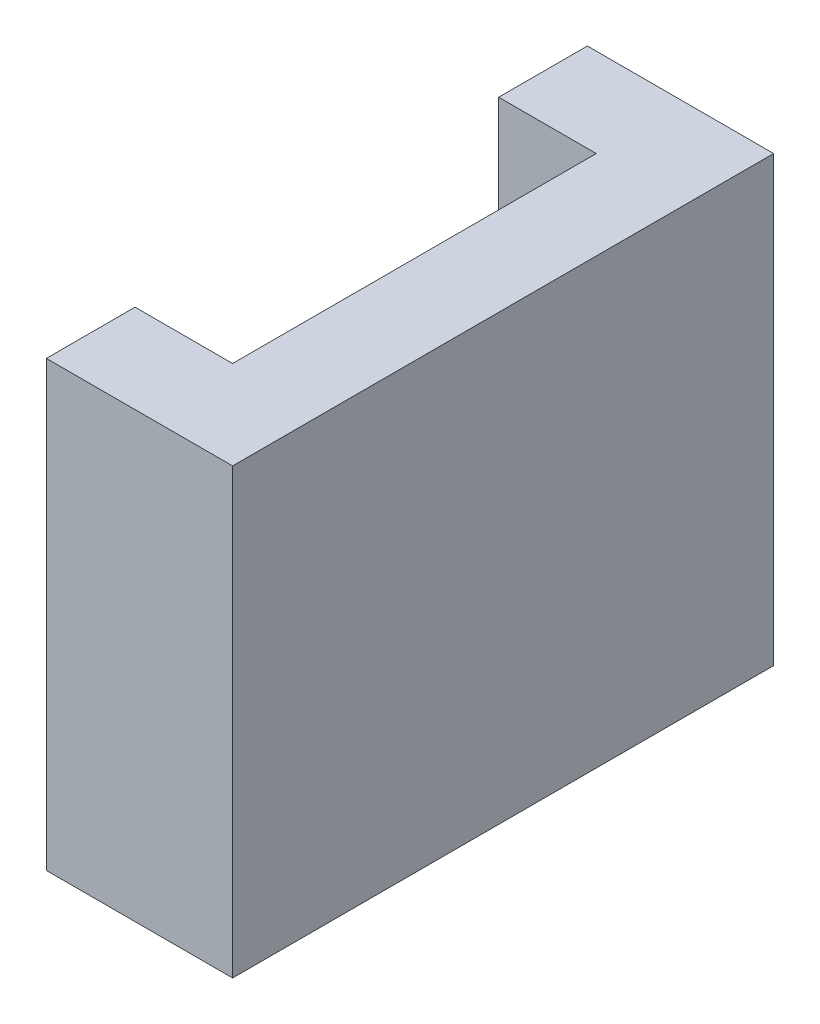
ISO-10303-21;
HEADER;
FILE_DESCRIPTION(('STEP AP214'),'2;1');
FILE_NAME('part.step','',(''),(''),'','','');
FILE_SCHEMA(('AUTOMOTIVE_DESIGN { 1 0 10303 214 1 1 1 1 }'));
ENDSEC;
DATA;
#1=APPLICATION_CONTEXT('core data for automotive mechanical design processes');
#2=APPLICATION_PROTOCOL_DEFINITION('international standard','automotive_design',2000,#1);
#3=PRODUCT_CONTEXT('',#1,'mechanical');
#4=PRODUCT('Part','Part','',(#3));
#5=PRODUCT_RELATED_PRODUCT_CATEGORY('part','',(#4));
#6=PRODUCT_DEFINITION_FORMATION('','',#4);
#7=PRODUCT_DEFINITION_CONTEXT('part definition',#1,'design');
#8=PRODUCT_DEFINITION('design','',#6,#7);
#9=PRODUCT_DEFINITION_SHAPE('','',#8);
#10=(LENGTH_UNIT() NAMED_UNIT(*) SI_UNIT(.MILLI.,.METRE.));
#11=(NAMED_UNIT(*) PLANE_ANGLE_UNIT() SI_UNIT($,.RADIAN.));
#12=(NAMED_UNIT(*) SI_UNIT($,.STERADIAN.) SOLID_ANGLE_UNIT());
#13=UNCERTAINTY_MEASURE_WITH_UNIT(LENGTH_MEASURE(1.E-05),#10,'distance_accuracy_value','');
#14=(GEOMETRIC_REPRESENTATION_CONTEXT(3) GLOBAL_UNCERTAINTY_ASSIGNED_CONTEXT((#13)) GLOBAL_UNIT_ASSIGNED_CONTEXT((#10,
#11,#12)) REPRESENTATION_CONTEXT('',''));
#15=CARTESIAN_POINT('',(0.,0.,0.));
#16=DIRECTION('',(0.,0.,1.));
#17=DIRECTION('',(1.,0.,0.));
#18=AXIS2_PLACEMENT_3D('',#15,#16,#17);
#19=CARTESIAN_POINT('',(5.5,0.,-10.6546391752577));
#20=DIRECTION('',(0.,0.,-1.));
#21=DIRECTION('',(0.,1.,0.));
#22=AXIS2_PLACEMENT_3D('',#19,#20,#21);
#23=PLANE('',#22);
#24=DIRECTION('',(0.,-1.,0.));
#25=VECTOR('',#24,1.);
#26=CARTESIAN_POINT('',(0.,0.,-10.6546391752577));
#27=LINE('',#26,#25);
#28=CARTESIAN_POINT('',(0.,13.1413205577831,-10.6546391752577));
#29=VERTEX_POINT('',#28);
#30=CARTESIAN_POINT('',(0.,-11.8586794422169,-10.6546391752577));
#31=VERTEX_POINT('',#30);
#32=EDGE_CURVE('E116',#29,#31,#27,.T.);
#33=ORIENTED_EDGE('',*,*,#32,.F.);
#34=DIRECTION('',(-1.,0.,0.));
#35=VECTOR('',#34,1.);
#36=CARTESIAN_POINT('',(5.5,13.1413205577831,-10.6546391752577));
#37=LINE('',#36,#35);
#38=CARTESIAN_POINT('',(10.5,13.1413205577831,-10.6546391752577));
#39=VERTEX_POINT('',#38);
#40=EDGE_CURVE('E11',#39,#29,#37,.T.);
#41=ORIENTED_EDGE('',*,*,#40,.F.);
#42=DIRECTION('',(0.,1.,0.));
#43=VECTOR('',#42,1.);
#44=CARTESIAN_POINT('',(10.5,13.1413205577831,-10.6546391752577));
#45=LINE('',#44,#43);
#46=CARTESIAN_POINT('',(10.5,-11.8586794422169,-10.6546391752577));
#47=VERTEX_POINT('',#46);
#48=EDGE_CURVE('E193',#47,#39,#45,.T.);
#49=ORIENTED_EDGE('',*,*,#48,.F.);
#50=DIRECTION('',(-1.,0.,0.));
#51=VECTOR('',#50,1.);
#52=CARTESIAN_POINT('',(5.5,-11.8586794422169,-10.6546391752577));
#53=LINE('',#52,#51);
#54=EDGE_CURVE('E111',#47,#31,#53,.T.);
#55=ORIENTED_EDGE('',*,*,#54,.T.);
#56=EDGE_LOOP('',(#33,#41,#49,#55));
#57=FACE_BOUND('',#56,.T.);
#58=ADVANCED_FACE('F41',(#57),#23,.T.);
#59=CARTESIAN_POINT('',(5.5,0.,-5.65463917525774));
#60=DIRECTION('',(0.,0.,-1.));
#61=DIRECTION('',(0.,1.,0.));
#62=AXIS2_PLACEMENT_3D('',#59,#60,#61);
#63=PLANE('',#62);
#64=DIRECTION('',(0.,-1.,0.));
#65=VECTOR('',#64,1.);
#66=CARTESIAN_POINT('',(0.,0.,-5.65463917525774));
#67=LINE('',#66,#65);
#68=CARTESIAN_POINT('',(0.,13.1413205577831,-5.65463917525773));
#69=VERTEX_POINT('',#68);
#70=CARTESIAN_POINT('',(0.,-6.85867944221686,-5.65463917525774));
#71=VERTEX_POINT('',#70);
#72=EDGE_CURVE('E145',#69,#71,#67,.T.);
#73=ORIENTED_EDGE('',*,*,#72,.T.);
#74=DIRECTION('',(-1.,0.,0.));
#75=VECTOR('',#74,1.);
#76=CARTESIAN_POINT('',(5.5,-6.85867944221686,-5.65463917525774));
#77=LINE('',#76,#75);
#78=CARTESIAN_POINT('',(5.5,-6.85867944221686,-5.65463917525774));
#79=VERTEX_POINT('',#78);
#80=EDGE_CURVE('E135',#79,#71,#77,.T.);
#81=ORIENTED_EDGE('',*,*,#80,.F.);
#82=DIRECTION('',(0.,-1.,0.));
#83=VECTOR('',#82,1.);
#84=CARTESIAN_POINT('',(5.5,0.,-5.65463917525774));
#85=LINE('',#84,#83);
#86=CARTESIAN_POINT('',(5.5,13.1413205577831,-5.65463917525773));
#87=VERTEX_POINT('',#86);
#88=EDGE_CURVE('E118',#87,#79,#85,.T.);
#89=ORIENTED_EDGE('',*,*,#88,.F.);
#90=DIRECTION('',(-1.,0.,0.));
#91=VECTOR('',#90,1.);
#92=CARTESIAN_POINT('',(5.5,13.1413205577831,-5.65463917525773));
#93=LINE('',#92,#91);
#94=EDGE_CURVE('E50',#87,#69,#93,.T.);
#95=ORIENTED_EDGE('',*,*,#94,.T.);
#96=EDGE_LOOP('',(#73,#81,#89,#95));
#97=FACE_BOUND('',#96,.T.);
#98=ADVANCED_FACE('F143',(#97),#63,.F.);
#99=CARTESIAN_POINT('',(5.5,-6.85867944221686,0.));
#100=DIRECTION('',(0.,1.,0.));
#101=DIRECTION('',(0.,0.,1.));
#102=AXIS2_PLACEMENT_3D('',#99,#100,#101);
#103=PLANE('',#102);
#104=DIRECTION('',(0.,0.,-1.));
#105=VECTOR('',#104,1.);
#106=CARTESIAN_POINT('',(0.,-6.85867944221686,0.));
#107=LINE('',#106,#105);
#108=CARTESIAN_POINT('',(0.,-6.85867944221686,14.8453608247423));
#109=VERTEX_POINT('',#108);
#110=EDGE_CURVE('E154',#109,#71,#107,.T.);
#111=ORIENTED_EDGE('',*,*,#110,.F.);
#112=DIRECTION('',(-1.,0.,0.));
#113=VECTOR('',#112,1.);
#114=CARTESIAN_POINT('',(5.5,-6.85867944221686,14.8453608247423));
#115=LINE('',#114,#113);
#116=CARTESIAN_POINT('',(5.5,-6.85867944221686,14.8453608247423));
#117=VERTEX_POINT('',#116);
#118=EDGE_CURVE('E132',#117,#109,#115,.T.);
#119=ORIENTED_EDGE('',*,*,#118,.F.);
#120=DIRECTION('',(0.,0.,-1.));
#121=VECTOR('',#120,1.);
#122=CARTESIAN_POINT('',(5.5,-6.85867944221686,0.));
#123=LINE('',#122,#121);
#124=EDGE_CURVE('E57',#117,#79,#123,.T.);
#125=ORIENTED_EDGE('',*,*,#124,.T.);
#126=ORIENTED_EDGE('',*,*,#80,.T.);
#127=EDGE_LOOP('',(#111,#119,#125,#126));
#128=FACE_BOUND('',#127,.T.);
#129=ADVANCED_FACE('F177',(#128),#103,.T.);
#130=CARTESIAN_POINT('',(5.5,0.,14.8453608247423));
#131=DIRECTION('',(0.,0.,-1.));
#132=DIRECTION('',(0.,1.,0.));
#133=AXIS2_PLACEMENT_3D('',#130,#131,#132);
#134=PLANE('',#133);
#135=DIRECTION('',(0.,-1.,0.));
#136=VECTOR('',#135,1.);
#137=CARTESIAN_POINT('',(0.,0.,14.8453608247423));
#138=LINE('',#137,#136);
#139=CARTESIAN_POINT('',(0.,13.1413205577831,14.8453608247423));
#140=VERTEX_POINT('',#139);
#141=EDGE_CURVE('E166',#140,#109,#138,.T.);
#142=ORIENTED_EDGE('',*,*,#141,.F.);
#143=DIRECTION('',(-1.,0.,0.));
#144=VECTOR('',#143,1.);
#145=CARTESIAN_POINT('',(5.5,13.1413205577831,14.8453608247423));
#146=LINE('',#145,#144);
#147=CARTESIAN_POINT('',(5.5,13.1413205577831,14.8453608247423));
#148=VERTEX_POINT('',#147);
#149=EDGE_CURVE('E129',#148,#140,#146,.T.);
#150=ORIENTED_EDGE('',*,*,#149,.F.);
#151=DIRECTION('',(0.,-1.,0.));
#152=VECTOR('',#151,1.);
#153=CARTESIAN_POINT('',(5.5,0.,14.8453608247423));
#154=LINE('',#153,#152);
#155=EDGE_CURVE('E125',#148,#117,#154,.T.);
#156=ORIENTED_EDGE('',*,*,#155,.T.);
#157=ORIENTED_EDGE('',*,*,#118,.T.);
#158=EDGE_LOOP('',(#142,#150,#156,#157));
#159=FACE_BOUND('',#158,.T.);
#160=ADVANCED_FACE('F173',(#159),#134,.T.);
#161=CARTESIAN_POINT('',(5.5,13.1413205577831,0.));
#162=DIRECTION('',(0.,1.,0.));
#163=DIRECTION('',(0.,0.,1.));
#164=AXIS2_PLACEMENT_3D('',#161,#162,#163);
#165=PLANE('',#164);
#166=DIRECTION('',(0.,0.,-1.));
#167=VECTOR('',#166,1.);
#168=CARTESIAN_POINT('',(0.,13.1413205577831,0.));
#169=LINE('',#168,#167);
#170=CARTESIAN_POINT('',(0.,13.1413205577831,19.8453608247423));
#171=VERTEX_POINT('',#170);
#172=EDGE_CURVE('E100',#171,#140,#169,.T.);
#173=ORIENTED_EDGE('',*,*,#172,.F.);
#174=DIRECTION('',(-1.,0.,0.));
#175=VECTOR('',#174,1.);
#176=CARTESIAN_POINT('',(5.5,13.1413205577831,19.8453608247423));
#177=LINE('',#176,#175);
#178=CARTESIAN_POINT('',(10.5,13.1413205577831,19.8453608247423));
#179=VERTEX_POINT('',#178);
#180=EDGE_CURVE('E93',#179,#171,#177,.T.);
#181=ORIENTED_EDGE('',*,*,#180,.F.);
#182=DIRECTION('',(0.,0.,1.));
#183=VECTOR('',#182,1.);
#184=CARTESIAN_POINT('',(10.5,13.1413205577831,19.8453608247423));
#185=LINE('',#184,#183);
#186=EDGE_CURVE('E163',#39,#179,#185,.T.);
#187=ORIENTED_EDGE('',*,*,#186,.F.);
#188=ORIENTED_EDGE('',*,*,#40,.T.);
#189=EDGE_CURVE('E151',#69,#29,#169,.T.);
#190=ORIENTED_EDGE('',*,*,#189,.F.);
#191=ORIENTED_EDGE('',*,*,#94,.F.);
#192=DIRECTION('',(0.,0.,1.));
#193=VECTOR('',#192,1.);
#194=CARTESIAN_POINT('',(5.5,13.1413205577831,19.8453608247423));
#195=LINE('',#194,#193);
#196=EDGE_CURVE('E203',#87,#148,#195,.T.);
#197=ORIENTED_EDGE('',*,*,#196,.T.);
#198=ORIENTED_EDGE('',*,*,#149,.T.);
#199=EDGE_LOOP('',(#173,#181,#187,#188,#190,#191,#197,#198));
#200=FACE_BOUND('',#199,.T.);
#201=ADVANCED_FACE('F157',(#200),#165,.T.);
#202=CARTESIAN_POINT('',(5.5,0.,19.8453608247423));
#203=DIRECTION('',(0.,0.,-1.));
#204=DIRECTION('',(-1.,0.,0.));
#205=AXIS2_PLACEMENT_3D('',#202,#203,#204);
#206=PLANE('',#205);
#207=DIRECTION('',(0.,-1.,0.));
#208=VECTOR('',#207,1.);
#209=CARTESIAN_POINT('',(0.,0.,19.8453608247423));
#210=LINE('',#209,#208);
#211=CARTESIAN_POINT('',(0.,-11.8586794422169,19.8453608247423));
#212=VERTEX_POINT('',#211);
#213=EDGE_CURVE('E85',#171,#212,#210,.T.);
#214=ORIENTED_EDGE('',*,*,#213,.T.);
#215=DIRECTION('',(-1.,0.,0.));
#216=VECTOR('',#215,1.);
#217=CARTESIAN_POINT('',(5.5,-11.8586794422169,19.8453608247423));
#218=LINE('',#217,#216);
#219=CARTESIAN_POINT('',(10.5,-11.8586794422169,19.8453608247423));
#220=VERTEX_POINT('',#219);
#221=EDGE_CURVE('E90',#220,#212,#218,.T.);
#222=ORIENTED_EDGE('',*,*,#221,.F.);
#223=DIRECTION('',(0.,-1.,0.));
#224=VECTOR('',#223,1.);
#225=CARTESIAN_POINT('',(10.5,13.1413205577831,19.8453608247423));
#226=LINE('',#225,#224);
#227=EDGE_CURVE('E194',#179,#220,#226,.T.);
#228=ORIENTED_EDGE('',*,*,#227,.F.);
#229=ORIENTED_EDGE('',*,*,#180,.T.);
#230=EDGE_LOOP('',(#214,#222,#228,#229));
#231=FACE_BOUND('',#230,.T.);
#232=ADVANCED_FACE('F87',(#231),#206,.F.);
#233=CARTESIAN_POINT('',(5.5,-11.8586794422169,0.));
#234=DIRECTION('',(0.,1.,0.));
#235=DIRECTION('',(0.,0.,1.));
#236=AXIS2_PLACEMENT_3D('',#233,#234,#235);
#237=PLANE('',#236);
#238=DIRECTION('',(0.,0.,-1.));
#239=VECTOR('',#238,1.);
#240=CARTESIAN_POINT('',(0.,-11.8586794422169,0.));
#241=LINE('',#240,#239);
#242=EDGE_CURVE('E99',#212,#31,#241,.T.);
#243=ORIENTED_EDGE('',*,*,#242,.T.);
#244=ORIENTED_EDGE('',*,*,#54,.F.);
#245=DIRECTION('',(0.,0.,-1.));
#246=VECTOR('',#245,1.);
#247=CARTESIAN_POINT('',(10.5,-11.8586794422169,19.8453608247423));
#248=LINE('',#247,#246);
#249=EDGE_CURVE('E108',#220,#47,#248,.T.);
#250=ORIENTED_EDGE('',*,*,#249,.F.);
#251=ORIENTED_EDGE('',*,*,#221,.T.);
#252=EDGE_LOOP('',(#243,#244,#250,#251));
#253=FACE_BOUND('',#252,.T.);
#254=ADVANCED_FACE('F104',(#253),#237,.F.);
#255=CARTESIAN_POINT('',(0.,0.,0.));
#256=DIRECTION('',(1.,0.,0.));
#257=DIRECTION('',(0.,0.,-1.));
#258=AXIS2_PLACEMENT_3D('',#255,#256,#257);
#259=PLANE('',#258);
#260=ORIENTED_EDGE('',*,*,#32,.T.);
#261=ORIENTED_EDGE('',*,*,#242,.F.);
#262=ORIENTED_EDGE('',*,*,#213,.F.);
#263=ORIENTED_EDGE('',*,*,#172,.T.);
#264=ORIENTED_EDGE('',*,*,#141,.T.);
#265=ORIENTED_EDGE('',*,*,#110,.T.);
#266=ORIENTED_EDGE('',*,*,#72,.F.);
#267=ORIENTED_EDGE('',*,*,#189,.T.);
#268=EDGE_LOOP('',(#260,#261,#262,#263,#264,#265,#266,#267));
#269=FACE_BOUND('',#268,.T.);
#270=ADVANCED_FACE('F113',(#269),#259,.F.);
#271=CARTESIAN_POINT('',(5.5,0.,0.));
#272=DIRECTION('',(1.,0.,0.));
#273=DIRECTION('',(0.,0.,-1.));
#274=AXIS2_PLACEMENT_3D('',#271,#272,#273);
#275=PLANE('',#274);
#276=ORIENTED_EDGE('',*,*,#196,.F.);
#277=ORIENTED_EDGE('',*,*,#88,.T.);
#278=ORIENTED_EDGE('',*,*,#124,.F.);
#279=ORIENTED_EDGE('',*,*,#155,.F.);
#280=EDGE_LOOP('',(#276,#277,#278,#279));
#281=FACE_BOUND('',#280,.T.);
#282=ADVANCED_FACE('F210',(#281),#275,.F.);
#283=CARTESIAN_POINT('',(10.5,0.,0.));
#284=DIRECTION('',(1.,0.,0.));
#285=DIRECTION('',(0.,0.,-1.));
#286=AXIS2_PLACEMENT_3D('',#283,#284,#285);
#287=PLANE('',#286);
#288=ORIENTED_EDGE('',*,*,#227,.T.);
#289=ORIENTED_EDGE('',*,*,#249,.T.);
#290=ORIENTED_EDGE('',*,*,#48,.T.);
#291=ORIENTED_EDGE('',*,*,#186,.T.);
#292=EDGE_LOOP('',(#288,#289,#290,#291));
#293=FACE_BOUND('',#292,.T.);
#294=ADVANCED_FACE('F191',(#293),#287,.T.);
#295=CLOSED_SHELL('',(#58,#98,#129,#160,#201,#232,#254,#270,#282,#294));
#296=MANIFOLD_SOLID_BREP('B2',#295);
#297=ADVANCED_BREP_SHAPE_REPRESENTATION('',(#18,#296),#14);
#298=SHAPE_DEFINITION_REPRESENTATION(#9,#297);
ENDSEC;
END-ISO-10303-21;
